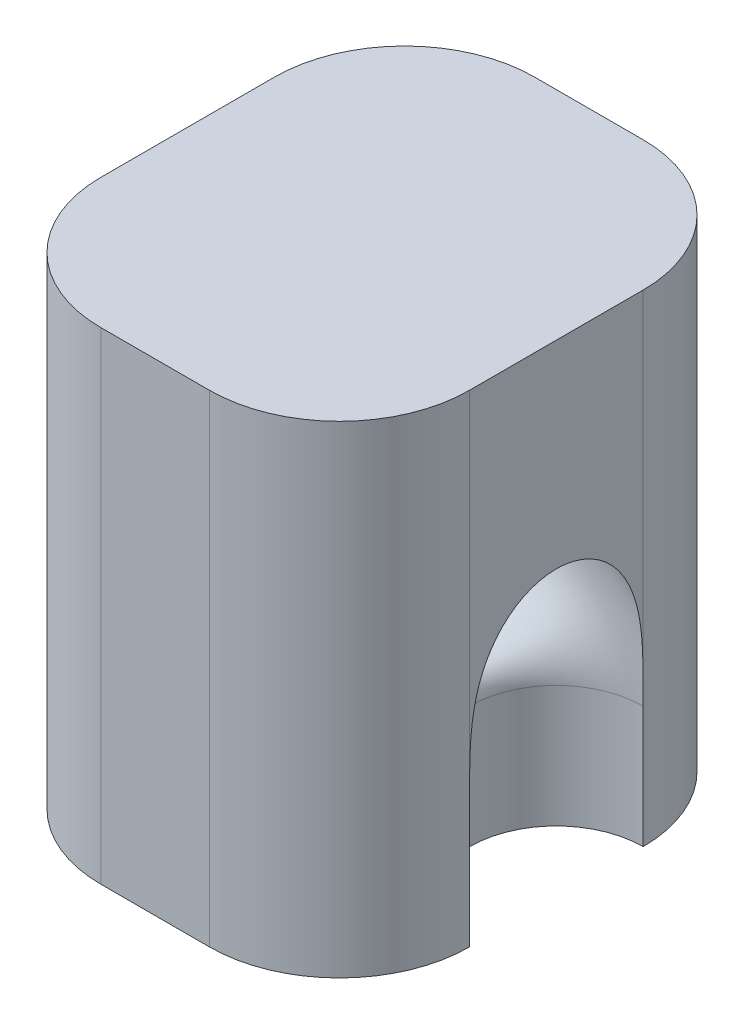
ISO-10303-21;
HEADER;
FILE_DESCRIPTION(('STEP AP214'),'2;1');
FILE_NAME('part.step','',(''),(''),'','','');
FILE_SCHEMA(('AUTOMOTIVE_DESIGN { 1 0 10303 214 1 1 1 1 }'));
ENDSEC;
DATA;
#1=APPLICATION_CONTEXT('core data for automotive mechanical design processes');
#2=APPLICATION_PROTOCOL_DEFINITION('international standard','automotive_design',2000,#1);
#3=PRODUCT_CONTEXT('',#1,'mechanical');
#4=PRODUCT('Part','Part','',(#3));
#5=PRODUCT_RELATED_PRODUCT_CATEGORY('part','',(#4));
#6=PRODUCT_DEFINITION_FORMATION('','',#4);
#7=PRODUCT_DEFINITION_CONTEXT('part definition',#1,'design');
#8=PRODUCT_DEFINITION('design','',#6,#7);
#9=PRODUCT_DEFINITION_SHAPE('','',#8);
#10=(LENGTH_UNIT() NAMED_UNIT(*) SI_UNIT(.MILLI.,.METRE.));
#11=(NAMED_UNIT(*) PLANE_ANGLE_UNIT() SI_UNIT($,.RADIAN.));
#12=(NAMED_UNIT(*) SI_UNIT($,.STERADIAN.) SOLID_ANGLE_UNIT());
#13=UNCERTAINTY_MEASURE_WITH_UNIT(LENGTH_MEASURE(1.E-05),#10,'distance_accuracy_value','');
#14=(GEOMETRIC_REPRESENTATION_CONTEXT(3) GLOBAL_UNCERTAINTY_ASSIGNED_CONTEXT((#13)) GLOBAL_UNIT_ASSIGNED_CONTEXT((#10,
#11,#12)) REPRESENTATION_CONTEXT('',''));
#15=CARTESIAN_POINT('',(0.,0.,0.));
#16=DIRECTION('',(0.,0.,1.));
#17=DIRECTION('',(1.,0.,0.));
#18=AXIS2_PLACEMENT_3D('',#15,#16,#17);
#19=CARTESIAN_POINT('',(33.,10.6109045973641,62.9026152266645));
#20=DIRECTION('',(-1.,0.,0.));
#21=DIRECTION('',(0.,0.,1.));
#22=AXIS2_PLACEMENT_3D('',#19,#20,#21);
#23=PLANE('',#22);
#24=DIRECTION('',(0.,0.,-1.));
#25=VECTOR('',#24,1.);
#26=CARTESIAN_POINT('',(33.,0.,62.9026152266645));
#27=LINE('',#26,#25);
#28=CARTESIAN_POINT('',(33.,0.,-3.));
#29=VERTEX_POINT('',#28);
#30=CARTESIAN_POINT('',(33.,0.,-7.00000000000001));
#31=VERTEX_POINT('',#30);
#32=EDGE_CURVE('E230',#29,#31,#27,.T.);
#33=ORIENTED_EDGE('',*,*,#32,.F.);
#34=DIRECTION('',(0.,-1.,0.));
#35=VECTOR('',#34,1.);
#36=CARTESIAN_POINT('',(33.,10.6109045973641,-3.));
#37=LINE('',#36,#35);
#38=CARTESIAN_POINT('',(33.,3.80545229868206,-3.));
#39=VERTEX_POINT('',#38);
#40=EDGE_CURVE('E178',#29,#39,#37,.F.);
#41=ORIENTED_EDGE('',*,*,#40,.T.);
#42=CARTESIAN_POINT('',(33.,5.30545229868207,-5.));
#43=DIRECTION('',(1.,0.,0.));
#44=DIRECTION('',(0.,1.,0.));
#45=AXIS2_PLACEMENT_3D('',#42,#43,#44);
#46=CIRCLE('',#45,2.5);
#47=CARTESIAN_POINT('',(33.,3.80545229868207,-7.00000000000001));
#48=VERTEX_POINT('',#47);
#49=EDGE_CURVE('E241',#39,#48,#46,.T.);
#50=ORIENTED_EDGE('',*,*,#49,.T.);
#51=DIRECTION('',(0.,-1.,0.));
#52=VECTOR('',#51,1.);
#53=CARTESIAN_POINT('',(33.,0.,-7.00000000000001));
#54=LINE('',#53,#52);
#55=EDGE_CURVE('E172',#48,#31,#54,.T.);
#56=ORIENTED_EDGE('',*,*,#55,.T.);
#57=EDGE_LOOP('',(#33,#41,#50,#56));
#58=FACE_BOUND('',#57,.T.);
#59=ADVANCED_FACE('F33',(#58),#23,.T.);
#60=CARTESIAN_POINT('',(22.5,17.9146219807209,-10.));
#61=DIRECTION('',(0.,0.,1.));
#62=DIRECTION('',(1.,0.,0.));
#63=AXIS2_PLACEMENT_3D('',#60,#61,#62);
#64=PLANE('',#63);
#65=DIRECTION('',(-1.,0.,0.));
#66=VECTOR('',#65,1.);
#67=CARTESIAN_POINT('',(35.,11.1125,-10.));
#68=LINE('',#67,#66);
#69=CARTESIAN_POINT('',(38.5,11.1125,-10.));
#70=VERTEX_POINT('',#69);
#71=CARTESIAN_POINT('',(36.,11.1125,-10.));
#72=VERTEX_POINT('',#71);
#73=EDGE_CURVE('E251',#70,#72,#68,.T.);
#74=ORIENTED_EDGE('',*,*,#73,.F.);
#75=DIRECTION('',(0.,-1.,0.));
#76=VECTOR('',#75,1.);
#77=CARTESIAN_POINT('',(38.5,17.9146219807209,-10.));
#78=LINE('',#77,#76);
#79=CARTESIAN_POINT('',(38.5,0.,-10.));
#80=VERTEX_POINT('',#79);
#81=EDGE_CURVE('E260',#70,#80,#78,.T.);
#82=ORIENTED_EDGE('',*,*,#81,.T.);
#83=DIRECTION('',(1.,0.,0.));
#84=VECTOR('',#83,1.);
#85=CARTESIAN_POINT('',(0.,0.,-10.));
#86=LINE('',#85,#84);
#87=CARTESIAN_POINT('',(36.,0.,-10.));
#88=VERTEX_POINT('',#87);
#89=EDGE_CURVE('E249',#88,#80,#86,.T.);
#90=ORIENTED_EDGE('',*,*,#89,.F.);
#91=DIRECTION('',(0.,-1.,0.));
#92=VECTOR('',#91,1.);
#93=CARTESIAN_POINT('',(36.,11.1125,-10.));
#94=LINE('',#93,#92);
#95=EDGE_CURVE('E133',#88,#72,#94,.F.);
#96=ORIENTED_EDGE('',*,*,#95,.T.);
#97=EDGE_LOOP('',(#74,#82,#90,#96));
#98=FACE_BOUND('',#97,.T.);
#99=ADVANCED_FACE('F197',(#98),#64,.F.);
#100=CARTESIAN_POINT('',(22.5,17.9146219807209,0.));
#101=DIRECTION('',(0.,0.,1.));
#102=DIRECTION('',(1.,0.,0.));
#103=AXIS2_PLACEMENT_3D('',#100,#101,#102);
#104=PLANE('',#103);
#105=DIRECTION('',(1.,0.,0.));
#106=VECTOR('',#105,1.);
#107=CARTESIAN_POINT('',(0.,0.,0.));
#108=LINE('',#107,#106);
#109=CARTESIAN_POINT('',(36.,0.,0.));
#110=VERTEX_POINT('',#109);
#111=CARTESIAN_POINT('',(38.5,0.,0.));
#112=VERTEX_POINT('',#111);
#113=EDGE_CURVE('E233',#110,#112,#108,.T.);
#114=ORIENTED_EDGE('',*,*,#113,.T.);
#115=DIRECTION('',(0.,-1.,0.));
#116=VECTOR('',#115,1.);
#117=CARTESIAN_POINT('',(38.5,11.1125,0.));
#118=LINE('',#117,#116);
#119=CARTESIAN_POINT('',(38.5,11.1125,0.));
#120=VERTEX_POINT('',#119);
#121=EDGE_CURVE('E148',#112,#120,#118,.F.);
#122=ORIENTED_EDGE('',*,*,#121,.T.);
#123=DIRECTION('',(-1.,0.,0.));
#124=VECTOR('',#123,1.);
#125=CARTESIAN_POINT('',(35.,11.1125,0.));
#126=LINE('',#125,#124);
#127=CARTESIAN_POINT('',(36.,11.1125,0.));
#128=VERTEX_POINT('',#127);
#129=EDGE_CURVE('E252',#120,#128,#126,.T.);
#130=ORIENTED_EDGE('',*,*,#129,.T.);
#131=DIRECTION('',(0.,-1.,0.));
#132=VECTOR('',#131,1.);
#133=CARTESIAN_POINT('',(36.,17.9146219807209,0.));
#134=LINE('',#133,#132);
#135=EDGE_CURVE('E168',#128,#110,#134,.T.);
#136=ORIENTED_EDGE('',*,*,#135,.T.);
#137=EDGE_LOOP('',(#114,#122,#130,#136));
#138=FACE_BOUND('',#137,.T.);
#139=ADVANCED_FACE('F200',(#138),#104,.T.);
#140=CARTESIAN_POINT('',(0.,0.,-10.));
#141=DIRECTION('',(0.,-1.,0.));
#142=DIRECTION('',(0.,0.,-1.));
#143=AXIS2_PLACEMENT_3D('',#140,#141,#142);
#144=PLANE('',#143);
#145=ORIENTED_EDGE('',*,*,#89,.T.);
#146=CARTESIAN_POINT('',(38.5,0.,-7.));
#147=DIRECTION('',(0.,-1.,0.));
#148=DIRECTION('',(0.,0.,-1.));
#149=AXIS2_PLACEMENT_3D('',#146,#147,#148);
#150=CIRCLE('',#149,3.);
#151=CARTESIAN_POINT('',(41.5,0.,-7.));
#152=VERTEX_POINT('',#151);
#153=EDGE_CURVE('E142',#80,#152,#150,.T.);
#154=ORIENTED_EDGE('',*,*,#153,.T.);
#155=CARTESIAN_POINT('',(41.5,0.,-5.));
#156=DIRECTION('',(0.,-1.,0.));
#157=DIRECTION('',(0.,0.,-1.));
#158=AXIS2_PLACEMENT_3D('',#155,#156,#157);
#159=CIRCLE('',#158,2.);
#160=CARTESIAN_POINT('',(41.5,0.,-3.));
#161=VERTEX_POINT('',#160);
#162=EDGE_CURVE('E125',#161,#152,#159,.T.);
#163=ORIENTED_EDGE('',*,*,#162,.F.);
#164=CARTESIAN_POINT('',(38.5,0.,-3.));
#165=DIRECTION('',(0.,-1.,0.));
#166=DIRECTION('',(0.,0.,-1.));
#167=AXIS2_PLACEMENT_3D('',#164,#165,#166);
#168=CIRCLE('',#167,3.);
#169=EDGE_CURVE('E140',#161,#112,#168,.T.);
#170=ORIENTED_EDGE('',*,*,#169,.T.);
#171=ORIENTED_EDGE('',*,*,#113,.F.);
#172=CARTESIAN_POINT('',(36.,0.,-3.));
#173=DIRECTION('',(0.,-1.,0.));
#174=DIRECTION('',(0.,0.,-1.));
#175=AXIS2_PLACEMENT_3D('',#172,#173,#174);
#176=CIRCLE('',#175,3.);
#177=EDGE_CURVE('E149',#110,#29,#176,.T.);
#178=ORIENTED_EDGE('',*,*,#177,.T.);
#179=ORIENTED_EDGE('',*,*,#32,.T.);
#180=CARTESIAN_POINT('',(36.,0.,-7.00000000000001));
#181=DIRECTION('',(0.,-1.,0.));
#182=DIRECTION('',(0.,0.,-1.));
#183=AXIS2_PLACEMENT_3D('',#180,#181,#182);
#184=CIRCLE('',#183,3.);
#185=EDGE_CURVE('E153',#31,#88,#184,.T.);
#186=ORIENTED_EDGE('',*,*,#185,.T.);
#187=EDGE_LOOP('',(#145,#154,#163,#170,#171,#178,#179,#186));
#188=FACE_BOUND('',#187,.T.);
#189=ADVANCED_FACE('F138',(#188),#144,.T.);
#190=CARTESIAN_POINT('',(35.,11.1125,-10.));
#191=DIRECTION('',(0.,1.,0.));
#192=DIRECTION('',(-1.,0.,0.));
#193=AXIS2_PLACEMENT_3D('',#190,#191,#192);
#194=PLANE('',#193);
#195=DIRECTION('',(0.,0.,-1.));
#196=VECTOR('',#195,1.);
#197=CARTESIAN_POINT('',(41.5,11.1125,-10.));
#198=LINE('',#197,#196);
#199=CARTESIAN_POINT('',(41.5,11.1125,-3.));
#200=VERTEX_POINT('',#199);
#201=CARTESIAN_POINT('',(41.5,11.1125,-7.));
#202=VERTEX_POINT('',#201);
#203=EDGE_CURVE('E273',#200,#202,#198,.T.);
#204=ORIENTED_EDGE('',*,*,#203,.T.);
#205=CARTESIAN_POINT('',(38.5,11.1125,-7.));
#206=DIRECTION('',(0.,1.,0.));
#207=DIRECTION('',(-1.,0.,0.));
#208=AXIS2_PLACEMENT_3D('',#205,#206,#207);
#209=CIRCLE('',#208,3.);
#210=EDGE_CURVE('E166',#202,#70,#209,.T.);
#211=ORIENTED_EDGE('',*,*,#210,.T.);
#212=ORIENTED_EDGE('',*,*,#73,.T.);
#213=CARTESIAN_POINT('',(36.,11.1125,-7.00000000000001));
#214=DIRECTION('',(0.,1.,0.));
#215=DIRECTION('',(-1.,0.,0.));
#216=AXIS2_PLACEMENT_3D('',#213,#214,#215);
#217=CIRCLE('',#216,3.);
#218=CARTESIAN_POINT('',(33.,11.1125,-7.00000000000001));
#219=VERTEX_POINT('',#218);
#220=EDGE_CURVE('E160',#72,#219,#217,.T.);
#221=ORIENTED_EDGE('',*,*,#220,.T.);
#222=DIRECTION('',(0.,0.,1.));
#223=VECTOR('',#222,1.);
#224=CARTESIAN_POINT('',(33.,11.1125,62.9026152266645));
#225=LINE('',#224,#223);
#226=CARTESIAN_POINT('',(33.,11.1125,-3.));
#227=VERTEX_POINT('',#226);
#228=EDGE_CURVE('E268',#219,#227,#225,.T.);
#229=ORIENTED_EDGE('',*,*,#228,.T.);
#230=CARTESIAN_POINT('',(36.,11.1125,-3.));
#231=DIRECTION('',(0.,1.,0.));
#232=DIRECTION('',(-1.,0.,0.));
#233=AXIS2_PLACEMENT_3D('',#230,#231,#232);
#234=CIRCLE('',#233,3.);
#235=EDGE_CURVE('E162',#227,#128,#234,.T.);
#236=ORIENTED_EDGE('',*,*,#235,.T.);
#237=ORIENTED_EDGE('',*,*,#129,.F.);
#238=CARTESIAN_POINT('',(38.5,11.1125,-3.));
#239=DIRECTION('',(0.,1.,0.));
#240=DIRECTION('',(-1.,0.,0.));
#241=AXIS2_PLACEMENT_3D('',#238,#239,#240);
#242=CIRCLE('',#241,3.);
#243=EDGE_CURVE('E164',#120,#200,#242,.T.);
#244=ORIENTED_EDGE('',*,*,#243,.T.);
#245=EDGE_LOOP('',(#204,#211,#212,#221,#229,#236,#237,#244));
#246=FACE_BOUND('',#245,.T.);
#247=ADVANCED_FACE('F195',(#246),#194,.T.);
#248=CARTESIAN_POINT('',(33.,6.80545229868206,-7.00000000000001));
#249=VERTEX_POINT('',#248);
#250=CARTESIAN_POINT('',(33.,6.80545229868207,-3.));
#251=VERTEX_POINT('',#250);
#252=EDGE_CURVE('E240',#249,#251,#46,.T.);
#253=ORIENTED_EDGE('',*,*,#252,.T.);
#254=DIRECTION('',(0.,-1.,0.));
#255=VECTOR('',#254,1.);
#256=CARTESIAN_POINT('',(33.,10.6109045973641,-3.));
#257=LINE('',#256,#255);
#258=EDGE_CURVE('E176',#251,#227,#257,.F.);
#259=ORIENTED_EDGE('',*,*,#258,.T.);
#260=ORIENTED_EDGE('',*,*,#228,.F.);
#261=DIRECTION('',(0.,-1.,0.));
#262=VECTOR('',#261,1.);
#263=CARTESIAN_POINT('',(33.,0.,-7.00000000000001));
#264=LINE('',#263,#262);
#265=EDGE_CURVE('E174',#219,#249,#264,.T.);
#266=ORIENTED_EDGE('',*,*,#265,.T.);
#267=EDGE_LOOP('',(#253,#259,#260,#266));
#268=FACE_BOUND('',#267,.T.);
#269=ADVANCED_FACE('F189',(#268),#23,.T.);
#270=CARTESIAN_POINT('',(39.,5.30545229868207,-5.));
#271=DIRECTION('',(-1.,0.,0.));
#272=DIRECTION('',(0.,0.,1.));
#273=AXIS2_PLACEMENT_3D('',#270,#271,#272);
#274=CYLINDRICAL_SURFACE('',#273,2.5);
#275=CARTESIAN_POINT('',(39.,5.30545229868207,-5.));
#276=DIRECTION('',(1.,0.,0.));
#277=DIRECTION('',(0.,1.,0.));
#278=AXIS2_PLACEMENT_3D('',#275,#276,#277);
#279=CIRCLE('',#278,2.5);
#280=CARTESIAN_POINT('',(39.,7.80545229868207,-5.));
#281=VERTEX_POINT('',#280);
#282=EDGE_CURVE('E234',#281,#281,#279,.T.);
#283=ORIENTED_EDGE('',*,*,#282,.T.);
#284=EDGE_LOOP('',(#283));
#285=FACE_BOUND('',#284,.T.);
#286=ORIENTED_EDGE('',*,*,#49,.F.);
#287=CARTESIAN_POINT('',(33.,3.80545229868206,-3.));
#288=CARTESIAN_POINT('',(33.0000066780657,3.86153493164068,-2.95792955387831));
#289=CARTESIAN_POINT('',(33.000885170512,3.9193832578688,-2.91823806848176));
#290=CARTESIAN_POINT('',(33.003832789912,4.03817259286443,-2.84386853587168));
#291=CARTESIAN_POINT('',(33.0059016495303,4.09911290442547,-2.8091893651679));
#292=CARTESIAN_POINT('',(33.0106776412208,4.22367653603658,-2.74507908324186));
#293=CARTESIAN_POINT('',(33.0133848088217,4.28730000527108,-2.7156482643066));
#294=CARTESIAN_POINT('',(33.0189549577311,4.41676919472114,-2.66223330711288));
#295=CARTESIAN_POINT('',(33.0218179446196,4.48261499448616,-2.63824936406617));
#296=CARTESIAN_POINT('',(33.0299802078502,4.68284532446787,-2.5747322334044));
#297=CARTESIAN_POINT('',(33.0348579864896,4.82002257862195,-2.54358249220483));
#298=CARTESIAN_POINT('',(33.0411004553504,5.09757563860978,-2.50471817907327));
#299=CARTESIAN_POINT('',(33.0424676845759,5.23794905864276,-2.49698666918348));
#300=CARTESIAN_POINT('',(33.0411005275398,5.51732758306778,-2.50509804045992));
#301=CARTESIAN_POINT('',(33.0383858289987,5.65633602132253,-2.52082776181419));
#302=CARTESIAN_POINT('',(33.0301030090878,5.9297632464949,-2.57519473372287));
#303=CARTESIAN_POINT('',(33.0245336410886,6.06418000085465,-2.61384199348635));
#304=CARTESIAN_POINT('',(33.0142623928658,6.30350075095229,-2.70489214258173));
#305=CARTESIAN_POINT('',(33.0095666644967,6.40965033806211,-2.75403774763696));
#306=CARTESIAN_POINT('',(33.0042204405734,6.56288742071753,-2.838458910302));
#307=CARTESIAN_POINT('',(33.0027214688565,6.61295352153051,-2.86837182346367));
#308=CARTESIAN_POINT('',(33.000612415103,6.7109005167975,-2.93163944666428));
#309=CARTESIAN_POINT('',(33.0000025873338,6.75878078238005,-2.96499513831217));
#310=CARTESIAN_POINT('',(33.,6.80545229868207,-3.));
#311=B_SPLINE_CURVE_WITH_KNOTS('',3,(#287,#288,#289,#290,#291,#292,#293,#294,#295,#296,#297,
#298,#299,#300,#301,#302,#303,#304,#305,#306,#307,#308,#309,#310),.UNSPECIFIED.,.F.,.F.,(4,2,2,
2,2,2,2,2,2,2,2,4),(0.,0.210235486583615,0.420423776401095,0.630623768202684,0.840831292217674,
1.26091362427922,1.68069204620186,2.09845230086933,2.51639514637855,2.8663990104264,
3.04128920196876,3.21622939687738),.UNSPECIFIED.);
#312=EDGE_CURVE('E11',#39,#251,#311,.T.);
#313=ORIENTED_EDGE('',*,*,#312,.T.);
#314=ORIENTED_EDGE('',*,*,#252,.F.);
#315=CARTESIAN_POINT('',(33.,6.80545229868206,-7.00000000000001));
#316=CARTESIAN_POINT('',(33.0000066780657,6.74936966572343,-7.0420704461217));
#317=CARTESIAN_POINT('',(33.000885170512,6.69152133949532,-7.08176193151825));
#318=CARTESIAN_POINT('',(33.003832789912,6.57273200449968,-7.15613146412833));
#319=CARTESIAN_POINT('',(33.0059016495303,6.51179169293864,-7.19081063483211));
#320=CARTESIAN_POINT('',(33.0106776412208,6.38722806132753,-7.25492091675814));
#321=CARTESIAN_POINT('',(33.0133848088217,6.32360459209303,-7.28435173569341));
#322=CARTESIAN_POINT('',(33.0189549577311,6.19413540264297,-7.33776669288712));
#323=CARTESIAN_POINT('',(33.0218179446196,6.12828960287795,-7.36175063593383));
#324=CARTESIAN_POINT('',(33.0299802078502,5.92805927289623,-7.4252677665956));
#325=CARTESIAN_POINT('',(33.0348579864896,5.79088201874215,-7.45641750779517));
#326=CARTESIAN_POINT('',(33.0411004553504,5.51332895875432,-7.49528182092673));
#327=CARTESIAN_POINT('',(33.0424676845759,5.37295553872134,-7.50301333081652));
#328=CARTESIAN_POINT('',(33.0411005275398,5.09357701429633,-7.49490195954007));
#329=CARTESIAN_POINT('',(33.0383858289987,4.95456857604157,-7.4791722381858));
#330=CARTESIAN_POINT('',(33.0301030090878,4.68114135086921,-7.42480526627712));
#331=CARTESIAN_POINT('',(33.0245336410886,4.54672459650946,-7.38615800651364));
#332=CARTESIAN_POINT('',(33.0142623928658,4.30740384641183,-7.29510785741826));
#333=CARTESIAN_POINT('',(33.0095666644967,4.20125425930202,-7.24596225236303));
#334=CARTESIAN_POINT('',(33.0042204405734,4.0480171766466,-7.161541089698));
#335=CARTESIAN_POINT('',(33.0027214688565,3.99795107583363,-7.13162817653633));
#336=CARTESIAN_POINT('',(33.000612415103,3.90000408056665,-7.06836055333572));
#337=CARTESIAN_POINT('',(33.0000025873338,3.85212381498409,-7.03500486168784));
#338=CARTESIAN_POINT('',(33.,3.80545229868207,-7.00000000000001));
#339=B_SPLINE_CURVE_WITH_KNOTS('',3,(#315,#316,#317,#318,#319,#320,#321,#322,#323,#324,#325,
#326,#327,#328,#329,#330,#331,#332,#333,#334,#335,#336,#337,#338),.UNSPECIFIED.,.F.,.F.,(4,2,2,
2,2,2,2,2,2,2,2,4),(0.,0.210235486583615,0.420423776401096,0.630623768202686,0.840831292217676,
1.26091362427923,1.68069204620186,2.09845230086933,2.51639514637855,2.86639901042638,
3.04128920196873,3.21622939687734),.UNSPECIFIED.);
#340=EDGE_CURVE('E47',#249,#48,#339,.T.);
#341=ORIENTED_EDGE('',*,*,#340,.T.);
#342=EDGE_LOOP('',(#286,#313,#314,#341));
#343=FACE_BOUND('',#342,.T.);
#344=ADVANCED_FACE('F183',(#285,#343),#274,.F.);
#345=CARTESIAN_POINT('',(39.,5.30545229868207,-5.));
#346=DIRECTION('',(-1.,0.,0.));
#347=DIRECTION('',(0.,1.,0.));
#348=AXIS2_PLACEMENT_3D('',#345,#346,#347);
#349=PLANE('',#348);
#350=CARTESIAN_POINT('',(39.,5.30545229868207,-5.));
#351=DIRECTION('',(1.,0.,0.));
#352=DIRECTION('',(0.,1.,0.));
#353=AXIS2_PLACEMENT_3D('',#350,#351,#352);
#354=CIRCLE('',#353,2.);
#355=CARTESIAN_POINT('',(39.,7.30545229868207,-5.));
#356=VERTEX_POINT('',#355);
#357=EDGE_CURVE('E143',#356,#356,#354,.T.);
#358=ORIENTED_EDGE('',*,*,#357,.T.);
#359=EDGE_LOOP('',(#358));
#360=FACE_BOUND('',#359,.T.);
#361=ORIENTED_EDGE('',*,*,#282,.F.);
#362=EDGE_LOOP('',(#361));
#363=FACE_BOUND('',#362,.T.);
#364=ADVANCED_FACE('F188',(#360,#363),#349,.T.);
#365=CARTESIAN_POINT('',(39.,2.80545229868206,-5.));
#366=DIRECTION('',(0.,0.,-1.));
#367=DIRECTION('',(1.,0.,0.));
#368=AXIS2_PLACEMENT_3D('',#365,#366,#367);
#369=TOROIDAL_SURFACE('',#368,2.5,2.);
#370=CARTESIAN_POINT('',(41.5,2.80545229868206,-5.));
#371=DIRECTION('',(0.,-1.,0.));
#372=DIRECTION('',(1.,0.,0.));
#373=AXIS2_PLACEMENT_3D('',#370,#371,#372);
#374=CIRCLE('',#373,2.);
#375=CARTESIAN_POINT('',(41.5,2.80545229868206,-3.));
#376=VERTEX_POINT('',#375);
#377=CARTESIAN_POINT('',(41.5,2.80545229868206,-7.));
#378=VERTEX_POINT('',#377);
#379=EDGE_CURVE('E128',#376,#378,#374,.T.);
#380=ORIENTED_EDGE('',*,*,#379,.T.);
#381=CARTESIAN_POINT('',(41.5,6.54710968545601,-5.));
#382=CARTESIAN_POINT('',(41.5,6.54710908215785,-4.90328522351418));
#383=CARTESIAN_POINT('',(41.5,6.5386384989145,-4.80656113901522));
#384=CARTESIAN_POINT('',(41.5,6.50514080635885,-4.61601950282432));
#385=CARTESIAN_POINT('',(41.5,6.48010956381419,-4.52220268285224));
#386=CARTESIAN_POINT('',(41.5,6.4146743376304,-4.340350515462));
#387=CARTESIAN_POINT('',(41.5,6.37430334234146,-4.25230323365959));
#388=CARTESIAN_POINT('',(41.5,6.27986522342328,-4.08393452730057));
#389=CARTESIAN_POINT('',(41.5,6.22579762647663,-4.00361336987024));
#390=CARTESIAN_POINT('',(41.5,6.10381733479791,-3.84948008805361));
#391=CARTESIAN_POINT('',(41.5,6.03547070876214,-3.7760133227842));
#392=CARTESIAN_POINT('',(41.5,5.88864369199963,-3.63999971017622));
#393=CARTESIAN_POINT('',(41.5,5.8101572358124,-3.57745945197606));
#394=CARTESIAN_POINT('',(41.5,5.66998838460916,-3.48056056384518));
#395=CARTESIAN_POINT('',(41.5,5.61024056797441,-3.4433492576002));
#396=CARTESIAN_POINT('',(41.5,5.48767224333894,-3.37435524878234));
#397=CARTESIAN_POINT('',(41.5,5.42485057002891,-3.34257462583453));
#398=CARTESIAN_POINT('',(41.5,5.23285381635623,-3.25511871764405));
#399=CARTESIAN_POINT('',(41.5,5.10007277341018,-3.20727971583229));
#400=CARTESIAN_POINT('',(41.5,4.81973124515746,-3.1268691567211));
#401=CARTESIAN_POINT('',(41.5,4.67179924977378,-3.0956660850382));
#402=CARTESIAN_POINT('',(41.5,4.37335337047095,-3.04894189690538));
#403=CARTESIAN_POINT('',(41.5,4.22283470551702,-3.03345394255031));
#404=CARTESIAN_POINT('',(41.5,3.92028112637125,-3.01251014918162));
#405=CARTESIAN_POINT('',(41.5,3.76824262569258,-3.00711790470912));
#406=CARTESIAN_POINT('',(41.5,3.54020837612306,-3.00260893081944));
#407=CARTESIAN_POINT('',(41.5,3.46422711457905,-3.00170220088952));
#408=CARTESIAN_POINT('',(41.5,3.3122589235233,-3.00054496693093));
#409=CARTESIAN_POINT('',(41.5,3.23627199407047,-3.00029445683515));
#410=CARTESIAN_POINT('',(41.5,3.04590276429221,-2.99994997044952));
#411=CARTESIAN_POINT('',(41.5,2.93152050422938,-2.99999904893986));
#412=CARTESIAN_POINT('',(41.5,2.70274764981297,-3.00000095152766));
#413=CARTESIAN_POINT('',(41.5,2.5883570557581,-2.99995376607704));
#414=CARTESIAN_POINT('',(41.5,2.35957773682491,-3.0002856223895));
#415=CARTESIAN_POINT('',(41.5,2.2451890134518,-3.0006646116545));
#416=CARTESIAN_POINT('',(41.5,2.0164677230781,-3.00333572830634));
#417=CARTESIAN_POINT('',(41.5,1.90213515606351,-3.00562785521558));
#418=CARTESIAN_POINT('',(41.5,1.55560876839363,-3.0187082651816));
#419=CARTESIAN_POINT('',(41.5,1.32335460181631,-3.03581719650441));
#420=CARTESIAN_POINT('',(41.5,0.979596765018527,-3.08917908054674));
#421=CARTESIAN_POINT('',(41.5,0.866050875868116,-3.11149550955332));
#422=CARTESIAN_POINT('',(41.5,0.641882085378463,-3.16760096774873));
#423=CARTESIAN_POINT('',(41.5,0.531256039706766,-3.20137706341044));
#424=CARTESIAN_POINT('',(41.5,0.311084615277422,-3.28374460944566));
#425=CARTESIAN_POINT('',(41.5,0.201714540023093,-3.33281598225175));
#426=CARTESIAN_POINT('',(41.5,-0.00874764420362937,-3.44675709570646));
#427=CARTESIAN_POINT('',(41.5,-0.109831241801234,-3.51164281479641));
#428=CARTESIAN_POINT('',(41.5,-0.300540659256211,-3.65811057916348));
#429=CARTESIAN_POINT('',(41.5,-0.390068487062603,-3.73982187525876));
#430=CARTESIAN_POINT('',(41.5,-0.552348901813307,-3.91852223333433));
#431=CARTESIAN_POINT('',(41.5,-0.625116302100345,-4.01549767580408));
#432=CARTESIAN_POINT('',(41.5,-0.744251433869852,-4.21286353291067));
#433=CARTESIAN_POINT('',(41.5,-0.792393324125643,-4.31218036636435));
#434=CARTESIAN_POINT('',(41.5,-0.868822736170034,-4.51819346438571));
#435=CARTESIAN_POINT('',(41.5,-0.897122233407728,-4.62488523517585));
#436=CARTESIAN_POINT('',(41.5,-0.930254112477697,-4.8291895909012));
#437=CARTESIAN_POINT('',(41.5,-0.937416653886646,-4.92643007019072));
#438=CARTESIAN_POINT('',(41.5,-0.934660239376815,-5.12065349415899));
#439=CARTESIAN_POINT('',(41.5,-0.924746717051987,-5.21763651092791));
#440=CARTESIAN_POINT('',(41.5,-0.888949319749511,-5.40503109931363));
#441=CARTESIAN_POINT('',(41.5,-0.863640976303796,-5.49555380276732));
#442=CARTESIAN_POINT('',(41.5,-0.798626899527984,-5.67123399150186));
#443=CARTESIAN_POINT('',(41.5,-0.758922765928507,-5.75639207169222));
#444=CARTESIAN_POINT('',(41.5,-0.665245793069824,-5.92189544146141));
#445=CARTESIAN_POINT('',(41.5,-0.610873444390628,-6.00201366650264));
#446=CARTESIAN_POINT('',(41.5,-0.490491138439331,-6.15299054431453));
#447=CARTESIAN_POINT('',(41.5,-0.424472717737249,-6.22384239737611));
#448=CARTESIAN_POINT('',(41.5,-0.276353079054847,-6.36152811615058));
#449=CARTESIAN_POINT('',(41.5,-0.193323516832369,-6.42735871575382));
#450=CARTESIAN_POINT('',(41.5,-0.0188620917749113,-6.54642925948175));
#451=CARTESIAN_POINT('',(41.5,0.0725632024918076,-6.59967893194872));
#452=CARTESIAN_POINT('',(41.5,0.240903846051742,-6.68388413608732));
#453=CARTESIAN_POINT('',(41.5,0.316676745872383,-6.7171704614299));
#454=CARTESIAN_POINT('',(41.5,0.470918545226293,-6.77685429613835));
#455=CARTESIAN_POINT('',(41.5,0.549389053489611,-6.8032476112585));
#456=CARTESIAN_POINT('',(41.5,0.788098904711628,-6.87316033943781));
#457=CARTESIAN_POINT('',(41.5,0.951124545695448,-6.90717013240464));
#458=CARTESIAN_POINT('',(41.5,1.32390836086258,-6.96316512932671));
#459=CARTESIAN_POINT('',(41.5,1.53440785255579,-6.97943034574844));
#460=CARTESIAN_POINT('',(41.5,1.85060242433868,-6.99281332828154));
#461=CARTESIAN_POINT('',(41.5,1.95622392376646,-6.99543440592521));
#462=CARTESIAN_POINT('',(41.5,2.16750240983045,-6.99870316444335));
#463=CARTESIAN_POINT('',(41.5,2.27315939298225,-6.99935100202086));
#464=CARTESIAN_POINT('',(41.5,2.48480182896059,-6.99999681091891));
#465=CARTESIAN_POINT('',(41.5,2.59078726233891,-6.99999271764622));
#466=CARTESIAN_POINT('',(41.5,2.80276160413362,-7.00000449505615));
#467=CARTESIAN_POINT('',(41.5,2.90875051257848,-7.00002036605979));
#468=CARTESIAN_POINT('',(41.5,3.12061156466212,-6.99994144045636));
#469=CARTESIAN_POINT('',(41.5,3.22648370893788,-6.99984676514268));
#470=CARTESIAN_POINT('',(41.5,3.43822069866265,-6.99864476879671));
#471=CARTESIAN_POINT('',(41.5,3.54408554417834,-6.99753750660019));
#472=CARTESIAN_POINT('',(41.5,3.741804642663,-6.99313261231835));
#473=CARTESIAN_POINT('',(41.5,3.83366446504584,-6.99014326651802));
#474=CARTESIAN_POINT('',(41.5,4.01725948293806,-6.98109235344597));
#475=CARTESIAN_POINT('',(41.5,4.10899465677123,-6.97503030700246));
#476=CARTESIAN_POINT('',(41.5,4.29182812849076,-6.95858878665871));
#477=CARTESIAN_POINT('',(41.5,4.3829275092408,-6.94822221417331));
#478=CARTESIAN_POINT('',(41.5,4.56430757555805,-6.9219264300691));
#479=CARTESIAN_POINT('',(41.5,4.65458841738984,-6.9059983041497));
#480=CARTESIAN_POINT('',(41.5,4.89243254692926,-6.85472034725994));
#481=CARTESIAN_POINT('',(41.5,5.0388237170767,-6.81348190798297));
#482=CARTESIAN_POINT('',(41.5,5.32332549262707,-6.70785571182567));
#483=CARTESIAN_POINT('',(41.5,5.46143857949944,-6.64347493308315));
#484=CARTESIAN_POINT('',(41.5,5.69028542428795,-6.50823773590623));
#485=CARTESIAN_POINT('',(41.5,5.78428370660306,-6.4429306303513));
#486=CARTESIAN_POINT('',(41.5,5.9603889716776,-6.29780914395982));
#487=CARTESIAN_POINT('',(41.5,6.04250335453703,-6.21800386157392));
#488=CARTESIAN_POINT('',(41.5,6.19180090559649,-6.04433583409737));
#489=CARTESIAN_POINT('',(41.5,6.25886983850566,-5.9503740341567));
#490=CARTESIAN_POINT('',(41.5,6.37372759712192,-5.75130058366548));
#491=CARTESIAN_POINT('',(41.5,6.42153241035431,-5.64619827064714));
#492=CARTESIAN_POINT('',(41.5,6.48753368579339,-5.45099985286652));
#493=CARTESIAN_POINT('',(41.5,6.50979693419786,-5.36226152670086));
#494=CARTESIAN_POINT('',(41.5,6.53958260288093,-5.18235097447038));
#495=CARTESIAN_POINT('',(41.5,6.54711025422637,-5.09117962377224));
#496=CARTESIAN_POINT('',(41.5,6.54710968545601,-5.));
#497=B_SPLINE_CURVE_WITH_KNOTS('',3,(#381,#382,#383,#384,#385,#386,#387,#388,#389,#390,#391,
#392,#393,#394,#395,#396,#397,#398,#399,#400,#401,#402,#403,#404,#405,#406,#407,#408,#409,#410,
#411,#412,#413,#414,#415,#416,#417,#418,#419,#420,#421,#422,#423,#424,#425,#426,#427,#428,#429,
#430,#431,#432,#433,#434,#435,#436,#437,#438,#439,#440,#441,#442,#443,#444,#445,#446,#447,#448,
#449,#450,#451,#452,#453,#454,#455,#456,#457,#458,#459,#460,#461,#462,#463,#464,#465,#466,#467,
#468,#469,#470,#471,#472,#473,#474,#475,#476,#477,#478,#479,#480,#481,#482,#483,#484,#485,#486,
#487,#488,#489,#490,#491,#492,#493,#494,#495,#496),.UNSPECIFIED.,.T.,.F.,(4,2,2,2,2,2,2,2,2,2,2,
2,2,2,2,2,2,2,2,2,2,2,2,2,2,2,2,2,2,2,2,2,2,2,2,2,2,2,2,2,2,2,2,2,2,2,2,2,2,2,2,2,2,2,2,2,2,4),
(0.,0.289797096125733,0.579666547511997,0.868916126728506,1.15817570298972,1.4580112847409,
1.75802706036247,1.96891629288571,2.17988610319926,2.60156124601546,3.0540002554849,
3.50739203009873,3.96363030866054,4.19159203709428,4.41955165789078,4.76269704039379,
5.10587645996895,5.44901360981311,5.79215067399624,6.48883938713469,6.83550834398002,
7.18178734013695,7.54026292696021,7.89910222156203,8.26080840112303,8.62219365714391,
8.95138930937168,9.28038611123744,9.57143759452452,9.86239648249951,10.1430945588683,
10.4237614522491,10.7130182790959,11.0024861871153,11.319156202792,11.6355805424999,
11.8835173970758,12.1316047661441,12.6294574813648,13.2616326817937,13.5786145054887,
13.8955711557076,14.2135315926389,14.5314971423436,14.8491141421706,15.1667126882213,
15.4424055575342,15.718141432959,15.9930567778429,16.2679184850675,16.7226313616567,
17.1772072429742,17.5192416094393,17.8610620662652,18.2053960649544,18.5494437052467,
18.8227522568344,19.0959637675791),.UNSPECIFIED.);
#498=EDGE_CURVE('E269',#378,#376,#497,.T.);
#499=ORIENTED_EDGE('',*,*,#498,.T.);
#500=EDGE_LOOP('',(#380,#499));
#501=FACE_BOUND('',#500,.T.);
#502=ORIENTED_EDGE('',*,*,#357,.F.);
#503=EDGE_LOOP('',(#502));
#504=FACE_BOUND('',#503,.T.);
#505=ADVANCED_FACE('F280',(#501,#504),#369,.F.);
#506=CARTESIAN_POINT('',(41.5,-5.65685424949238,-5.));
#507=DIRECTION('',(0.,1.,0.));
#508=DIRECTION('',(-1.,0.,0.));
#509=AXIS2_PLACEMENT_3D('',#506,#507,#508);
#510=CYLINDRICAL_SURFACE('',#509,2.);
#511=DIRECTION('',(0.,1.,0.));
#512=VECTOR('',#511,1.);
#513=CARTESIAN_POINT('',(41.5,-5.65685424949238,-3.));
#514=LINE('',#513,#512);
#515=EDGE_CURVE('E121',#161,#376,#514,.T.);
#516=ORIENTED_EDGE('',*,*,#515,.F.);
#517=ORIENTED_EDGE('',*,*,#162,.T.);
#518=DIRECTION('',(0.,1.,0.));
#519=VECTOR('',#518,1.);
#520=CARTESIAN_POINT('',(41.5,-5.65685424949238,-7.));
#521=LINE('',#520,#519);
#522=EDGE_CURVE('E134',#378,#152,#521,.F.);
#523=ORIENTED_EDGE('',*,*,#522,.F.);
#524=ORIENTED_EDGE('',*,*,#379,.F.);
#525=EDGE_LOOP('',(#516,#517,#523,#524));
#526=FACE_BOUND('',#525,.T.);
#527=ADVANCED_FACE('F123',(#526),#510,.F.);
#528=CARTESIAN_POINT('',(41.5,11.1125,-10.));
#529=DIRECTION('',(-1.,0.,0.));
#530=DIRECTION('',(0.,0.,1.));
#531=AXIS2_PLACEMENT_3D('',#528,#529,#530);
#532=PLANE('',#531);
#533=ORIENTED_EDGE('',*,*,#498,.F.);
#534=DIRECTION('',(0.,-1.,0.));
#535=VECTOR('',#534,1.);
#536=CARTESIAN_POINT('',(41.5,11.1125,-7.));
#537=LINE('',#536,#535);
#538=EDGE_CURVE('E158',#378,#202,#537,.F.);
#539=ORIENTED_EDGE('',*,*,#538,.T.);
#540=ORIENTED_EDGE('',*,*,#203,.F.);
#541=DIRECTION('',(0.,-1.,0.));
#542=VECTOR('',#541,1.);
#543=CARTESIAN_POINT('',(41.5,0.,-3.));
#544=LINE('',#543,#542);
#545=EDGE_CURVE('E151',#200,#376,#544,.T.);
#546=ORIENTED_EDGE('',*,*,#545,.T.);
#547=EDGE_LOOP('',(#533,#539,#540,#546));
#548=FACE_BOUND('',#547,.T.);
#549=ADVANCED_FACE('F213',(#548),#532,.F.);
#550=CARTESIAN_POINT('',(38.5,17.9146219807209,-7.));
#551=DIRECTION('',(0.,-1.,0.));
#552=DIRECTION('',(0.,0.,-1.));
#553=AXIS2_PLACEMENT_3D('',#550,#551,#552);
#554=CYLINDRICAL_SURFACE('',#553,3.);
#555=ORIENTED_EDGE('',*,*,#538,.F.);
#556=ORIENTED_EDGE('',*,*,#522,.T.);
#557=ORIENTED_EDGE('',*,*,#153,.F.);
#558=ORIENTED_EDGE('',*,*,#81,.F.);
#559=ORIENTED_EDGE('',*,*,#210,.F.);
#560=EDGE_LOOP('',(#555,#556,#557,#558,#559));
#561=FACE_BOUND('',#560,.T.);
#562=ADVANCED_FACE('F210',(#561),#554,.T.);
#563=CARTESIAN_POINT('',(38.5,11.1125,-3.));
#564=DIRECTION('',(0.,1.,0.));
#565=DIRECTION('',(0.,0.,1.));
#566=AXIS2_PLACEMENT_3D('',#563,#564,#565);
#567=CYLINDRICAL_SURFACE('',#566,3.);
#568=ORIENTED_EDGE('',*,*,#243,.F.);
#569=ORIENTED_EDGE('',*,*,#121,.F.);
#570=ORIENTED_EDGE('',*,*,#169,.F.);
#571=ORIENTED_EDGE('',*,*,#515,.T.);
#572=ORIENTED_EDGE('',*,*,#545,.F.);
#573=EDGE_LOOP('',(#568,#569,#570,#571,#572));
#574=FACE_BOUND('',#573,.T.);
#575=ADVANCED_FACE('F147',(#574),#567,.T.);
#576=CARTESIAN_POINT('',(36.,17.9146219807209,-3.));
#577=DIRECTION('',(0.,-1.,0.));
#578=DIRECTION('',(0.,0.,-1.));
#579=AXIS2_PLACEMENT_3D('',#576,#577,#578);
#580=CYLINDRICAL_SURFACE('',#579,3.);
#581=ORIENTED_EDGE('',*,*,#312,.F.);
#582=ORIENTED_EDGE('',*,*,#40,.F.);
#583=ORIENTED_EDGE('',*,*,#177,.F.);
#584=ORIENTED_EDGE('',*,*,#135,.F.);
#585=ORIENTED_EDGE('',*,*,#235,.F.);
#586=ORIENTED_EDGE('',*,*,#258,.F.);
#587=EDGE_LOOP('',(#581,#582,#583,#584,#585,#586));
#588=FACE_BOUND('',#587,.T.);
#589=ADVANCED_FACE('F216',(#588),#580,.T.);
#590=CARTESIAN_POINT('',(36.,10.6109045973641,-7.00000000000001));
#591=DIRECTION('',(0.,1.,0.));
#592=DIRECTION('',(0.,0.,1.));
#593=AXIS2_PLACEMENT_3D('',#590,#591,#592);
#594=CYLINDRICAL_SURFACE('',#593,3.);
#595=ORIENTED_EDGE('',*,*,#220,.F.);
#596=ORIENTED_EDGE('',*,*,#95,.F.);
#597=ORIENTED_EDGE('',*,*,#185,.F.);
#598=ORIENTED_EDGE('',*,*,#55,.F.);
#599=ORIENTED_EDGE('',*,*,#340,.F.);
#600=ORIENTED_EDGE('',*,*,#265,.F.);
#601=EDGE_LOOP('',(#595,#596,#597,#598,#599,#600));
#602=FACE_BOUND('',#601,.T.);
#603=ADVANCED_FACE('F35',(#602),#594,.T.);
#604=CLOSED_SHELL('',(#59,#99,#139,#189,#247,#269,#344,#364,#505,#527,#549,#562,#575,#589,#603));
#605=MANIFOLD_SOLID_BREP('B2',#604);
#606=ADVANCED_BREP_SHAPE_REPRESENTATION('',(#18,#605),#14);
#607=SHAPE_DEFINITION_REPRESENTATION(#9,#606);
ENDSEC;
END-ISO-10303-21;
